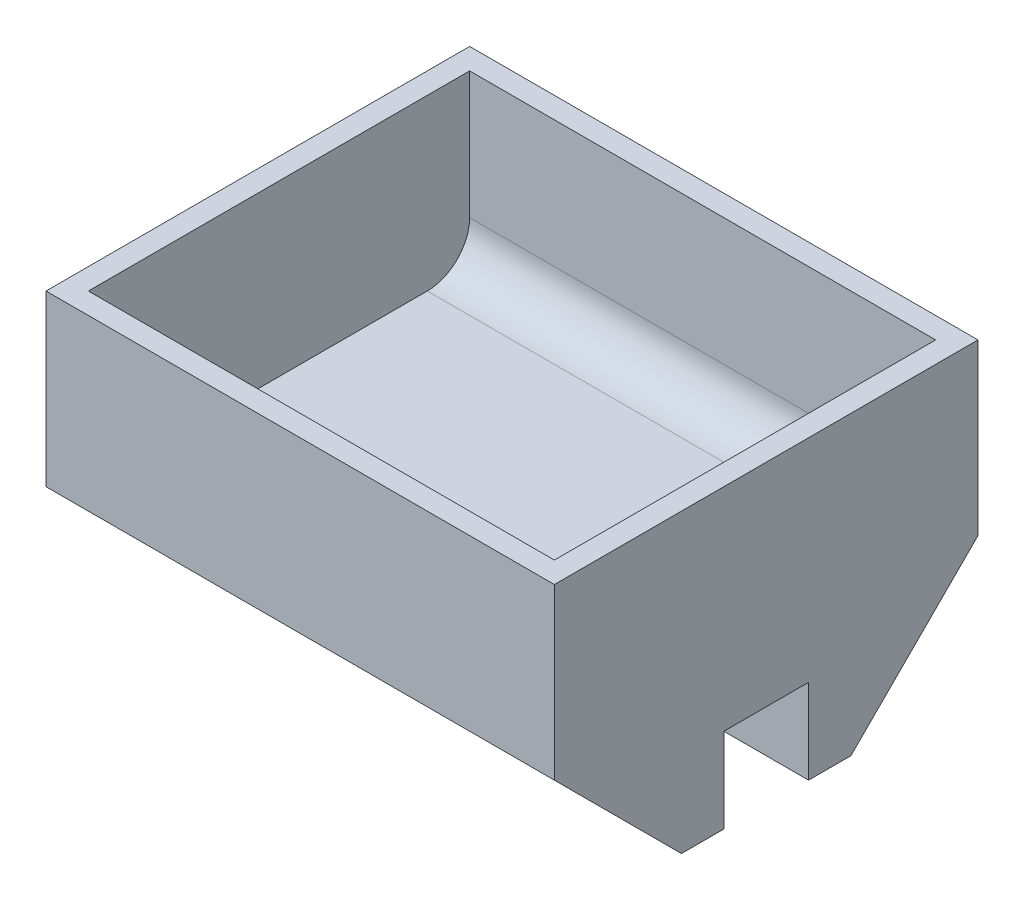
ISO-10303-21;
HEADER;
FILE_DESCRIPTION(('STEP AP214'),'2;1');
FILE_NAME('part.step','',(''),(''),'','','');
FILE_SCHEMA(('AUTOMOTIVE_DESIGN { 1 0 10303 214 1 1 1 1 }'));
ENDSEC;
DATA;
#1=APPLICATION_CONTEXT('core data for automotive mechanical design processes');
#2=APPLICATION_PROTOCOL_DEFINITION('international standard','automotive_design',2000,#1);
#3=PRODUCT_CONTEXT('',#1,'mechanical');
#4=PRODUCT('Part','Part','',(#3));
#5=PRODUCT_RELATED_PRODUCT_CATEGORY('part','',(#4));
#6=PRODUCT_DEFINITION_FORMATION('','',#4);
#7=PRODUCT_DEFINITION_CONTEXT('part definition',#1,'design');
#8=PRODUCT_DEFINITION('design','',#6,#7);
#9=PRODUCT_DEFINITION_SHAPE('','',#8);
#10=(LENGTH_UNIT() NAMED_UNIT(*) SI_UNIT(.MILLI.,.METRE.));
#11=(NAMED_UNIT(*) PLANE_ANGLE_UNIT() SI_UNIT($,.RADIAN.));
#12=(NAMED_UNIT(*) SI_UNIT($,.STERADIAN.) SOLID_ANGLE_UNIT());
#13=UNCERTAINTY_MEASURE_WITH_UNIT(LENGTH_MEASURE(1.E-05),#10,'distance_accuracy_value','');
#14=(GEOMETRIC_REPRESENTATION_CONTEXT(3) GLOBAL_UNCERTAINTY_ASSIGNED_CONTEXT((#13)) GLOBAL_UNIT_ASSIGNED_CONTEXT((#10,
#11,#12)) REPRESENTATION_CONTEXT('',''));
#15=CARTESIAN_POINT('',(0.,0.,0.));
#16=DIRECTION('',(0.,0.,1.));
#17=DIRECTION('',(1.,0.,0.));
#18=AXIS2_PLACEMENT_3D('',#15,#16,#17);
#19=CARTESIAN_POINT('',(50.8,-6.35000000000005,88.9));
#20=DIRECTION('',(0.,0.,-1.));
#21=DIRECTION('',(0.,1.,0.));
#22=AXIS2_PLACEMENT_3D('',#19,#20,#21);
#23=CYLINDRICAL_SURFACE('',#22,6.35);
#24=CARTESIAN_POINT('',(50.8,-6.35000000000003,63.4999999999999));
#25=DIRECTION('',(0.,-0.707106781186548,0.707106781186547));
#26=DIRECTION('',(0.,-0.707106781186547,-0.707106781186548));
#27=AXIS2_PLACEMENT_3D('',#24,#25,#26);
#28=ELLIPSE('',#27,8.98025612106916,6.35);
#29=CARTESIAN_POINT('',(50.8,-12.7,57.1499999999999));
#30=VERTEX_POINT('',#29);
#31=EDGE_CURVE('E222',#30,#30,#28,.T.);
#32=ORIENTED_EDGE('',*,*,#31,.T.);
#33=EDGE_LOOP('',(#32));
#34=FACE_BOUND('',#33,.T.);
#35=CARTESIAN_POINT('',(50.8,-6.35000000000002,48.26));
#36=DIRECTION('',(0.,0.,-1.));
#37=DIRECTION('',(-1.,0.,0.));
#38=AXIS2_PLACEMENT_3D('',#35,#36,#37);
#39=CIRCLE('',#38,6.35);
#40=CARTESIAN_POINT('',(44.45,-6.35000000000002,48.26));
#41=VERTEX_POINT('',#40);
#42=EDGE_CURVE('E11',#41,#41,#39,.F.);
#43=ORIENTED_EDGE('',*,*,#42,.F.);
#44=EDGE_LOOP('',(#43));
#45=FACE_BOUND('',#44,.T.);
#46=ADVANCED_FACE('F39',(#34,#45),#23,.F.);
#47=CARTESIAN_POINT('',(0.,-6.35000000000005,88.9));
#48=DIRECTION('',(0.,0.,-1.));
#49=DIRECTION('',(0.,1.,0.));
#50=AXIS2_PLACEMENT_3D('',#47,#48,#49);
#51=CYLINDRICAL_SURFACE('',#50,6.35);
#52=CARTESIAN_POINT('',(0.,-6.35000000000003,63.4999999999999));
#53=DIRECTION('',(0.,-0.707106781186548,0.707106781186547));
#54=DIRECTION('',(0.,-0.707106781186547,-0.707106781186548));
#55=AXIS2_PLACEMENT_3D('',#52,#53,#54);
#56=ELLIPSE('',#55,8.98025612106915,6.35);
#57=CARTESIAN_POINT('',(0.,-12.7,57.1499999999999));
#58=VERTEX_POINT('',#57);
#59=EDGE_CURVE('E217',#58,#58,#56,.T.);
#60=ORIENTED_EDGE('',*,*,#59,.T.);
#61=EDGE_LOOP('',(#60));
#62=FACE_BOUND('',#61,.T.);
#63=CARTESIAN_POINT('',(0.,-6.35000000000002,48.26));
#64=DIRECTION('',(0.,0.,-1.));
#65=DIRECTION('',(-1.,0.,0.));
#66=AXIS2_PLACEMENT_3D('',#63,#64,#65);
#67=CIRCLE('',#66,6.35);
#68=CARTESIAN_POINT('',(-6.35,-6.35000000000002,48.26));
#69=VERTEX_POINT('',#68);
#70=EDGE_CURVE('E48',#69,#69,#67,.F.);
#71=ORIENTED_EDGE('',*,*,#70,.F.);
#72=EDGE_LOOP('',(#71));
#73=FACE_BOUND('',#72,.T.);
#74=ADVANCED_FACE('F359',(#62,#73),#51,.F.);
#75=CARTESIAN_POINT('',(-50.8,-6.35000000000005,88.9));
#76=DIRECTION('',(0.,0.,-1.));
#77=DIRECTION('',(0.,1.,0.));
#78=AXIS2_PLACEMENT_3D('',#75,#76,#77);
#79=CYLINDRICAL_SURFACE('',#78,6.35);
#80=CARTESIAN_POINT('',(-50.8,-6.35000000000003,63.4999999999999));
#81=DIRECTION('',(0.,-0.707106781186548,0.707106781186547));
#82=DIRECTION('',(0.,-0.707106781186547,-0.707106781186548));
#83=AXIS2_PLACEMENT_3D('',#80,#81,#82);
#84=ELLIPSE('',#83,8.98025612106916,6.35);
#85=CARTESIAN_POINT('',(-50.8,-12.7,57.1499999999999));
#86=VERTEX_POINT('',#85);
#87=EDGE_CURVE('E227',#86,#86,#84,.T.);
#88=ORIENTED_EDGE('',*,*,#87,.T.);
#89=EDGE_LOOP('',(#88));
#90=FACE_BOUND('',#89,.T.);
#91=CARTESIAN_POINT('',(-50.8,-6.35000000000002,48.26));
#92=DIRECTION('',(0.,0.,-1.));
#93=DIRECTION('',(-1.,0.,0.));
#94=AXIS2_PLACEMENT_3D('',#91,#92,#93);
#95=CIRCLE('',#94,6.35);
#96=CARTESIAN_POINT('',(-57.15,-6.35000000000002,48.26));
#97=VERTEX_POINT('',#96);
#98=EDGE_CURVE('E349',#97,#97,#95,.F.);
#99=ORIENTED_EDGE('',*,*,#98,.F.);
#100=EDGE_LOOP('',(#99));
#101=FACE_BOUND('',#100,.T.);
#102=ADVANCED_FACE('F361',(#90,#101),#79,.F.);
#103=CARTESIAN_POINT('',(-231.223256319818,69.85,88.9));
#104=DIRECTION('',(0.,1.,0.));
#105=DIRECTION('',(0.,0.,1.));
#106=AXIS2_PLACEMENT_3D('',#103,#104,#105);
#107=PLANE('',#106);
#108=DIRECTION('',(0.,0.,-1.));
#109=VECTOR('',#108,1.);
#110=CARTESIAN_POINT('',(-76.2,69.85,88.9));
#111=LINE('',#110,#109);
#112=CARTESIAN_POINT('',(-76.2,69.85,88.9));
#113=VERTEX_POINT('',#112);
#114=CARTESIAN_POINT('',(-76.2,69.85,-38.1));
#115=VERTEX_POINT('',#114);
#116=EDGE_CURVE('E235',#113,#115,#111,.T.);
#117=ORIENTED_EDGE('',*,*,#116,.F.);
#118=DIRECTION('',(1.,0.,0.));
#119=VECTOR('',#118,1.);
#120=CARTESIAN_POINT('',(-231.223256319818,69.85,88.9));
#121=LINE('',#120,#119);
#122=CARTESIAN_POINT('',(76.2,69.85,88.9));
#123=VERTEX_POINT('',#122);
#124=EDGE_CURVE('E268',#113,#123,#121,.T.);
#125=ORIENTED_EDGE('',*,*,#124,.T.);
#126=DIRECTION('',(0.,0.,1.));
#127=VECTOR('',#126,1.);
#128=CARTESIAN_POINT('',(76.2,69.85,88.9));
#129=LINE('',#128,#127);
#130=CARTESIAN_POINT('',(76.2,69.85,-38.1));
#131=VERTEX_POINT('',#130);
#132=EDGE_CURVE('E253',#131,#123,#129,.T.);
#133=ORIENTED_EDGE('',*,*,#132,.F.);
#134=DIRECTION('',(1.,0.,0.));
#135=VECTOR('',#134,1.);
#136=CARTESIAN_POINT('',(-231.223256319818,69.85,-38.1));
#137=LINE('',#136,#135);
#138=EDGE_CURVE('E271',#115,#131,#137,.T.);
#139=ORIENTED_EDGE('',*,*,#138,.F.);
#140=EDGE_LOOP('',(#117,#125,#133,#139));
#141=FACE_BOUND('',#140,.T.);
#142=DIRECTION('',(1.,0.,0.));
#143=VECTOR('',#142,1.);
#144=CARTESIAN_POINT('',(-69.85,69.85,82.55));
#145=LINE('',#144,#143);
#146=CARTESIAN_POINT('',(-69.85,69.85,82.55));
#147=VERTEX_POINT('',#146);
#148=CARTESIAN_POINT('',(69.85,69.85,82.55));
#149=VERTEX_POINT('',#148);
#150=EDGE_CURVE('E158',#147,#149,#145,.T.);
#151=ORIENTED_EDGE('',*,*,#150,.F.);
#152=DIRECTION('',(0.,0.,1.));
#153=VECTOR('',#152,1.);
#154=CARTESIAN_POINT('',(-69.85,69.85,82.55));
#155=LINE('',#154,#153);
#156=CARTESIAN_POINT('',(-69.85,69.85,-31.75));
#157=VERTEX_POINT('',#156);
#158=EDGE_CURVE('E166',#157,#147,#155,.T.);
#159=ORIENTED_EDGE('',*,*,#158,.F.);
#160=DIRECTION('',(1.,0.,0.));
#161=VECTOR('',#160,1.);
#162=CARTESIAN_POINT('',(-69.85,69.85,-31.75));
#163=LINE('',#162,#161);
#164=CARTESIAN_POINT('',(69.85,69.85,-31.75));
#165=VERTEX_POINT('',#164);
#166=EDGE_CURVE('E200',#157,#165,#163,.T.);
#167=ORIENTED_EDGE('',*,*,#166,.T.);
#168=DIRECTION('',(0.,0.,1.));
#169=VECTOR('',#168,1.);
#170=CARTESIAN_POINT('',(69.85,69.85,82.55));
#171=LINE('',#170,#169);
#172=EDGE_CURVE('E180',#165,#149,#171,.T.);
#173=ORIENTED_EDGE('',*,*,#172,.T.);
#174=EDGE_LOOP('',(#151,#159,#167,#173));
#175=FACE_BOUND('',#174,.T.);
#176=ADVANCED_FACE('F179',(#141,#175),#107,.T.);
#177=CARTESIAN_POINT('',(50.8,-6.34999999999999,-12.7));
#178=DIRECTION('',(0.,-0.707106781186547,-0.707106781186547));
#179=DIRECTION('',(0.,0.707106781186548,-0.707106781186548));
#180=AXIS2_PLACEMENT_3D('',#177,#178,#179);
#181=ELLIPSE('',#180,8.98025612106916,6.35);
#182=CARTESIAN_POINT('',(50.8,0.,-19.05));
#183=VERTEX_POINT('',#182);
#184=EDGE_CURVE('E221',#183,#183,#181,.T.);
#185=ORIENTED_EDGE('',*,*,#184,.T.);
#186=EDGE_LOOP('',(#185));
#187=FACE_BOUND('',#186,.T.);
#188=CARTESIAN_POINT('',(50.8,-6.35,2.54));
#189=DIRECTION('',(0.,0.,1.));
#190=DIRECTION('',(1.,0.,0.));
#191=AXIS2_PLACEMENT_3D('',#188,#189,#190);
#192=CIRCLE('',#191,6.35);
#193=CARTESIAN_POINT('',(57.15,-6.35,2.54));
#194=VERTEX_POINT('',#193);
#195=EDGE_CURVE('E345',#194,#194,#192,.F.);
#196=ORIENTED_EDGE('',*,*,#195,.F.);
#197=EDGE_LOOP('',(#196));
#198=FACE_BOUND('',#197,.T.);
#199=ADVANCED_FACE('F374',(#187,#198),#23,.F.);
#200=CARTESIAN_POINT('',(0.,-6.34999999999999,-12.7));
#201=DIRECTION('',(0.,-0.707106781186547,-0.707106781186547));
#202=DIRECTION('',(0.,0.707106781186548,-0.707106781186548));
#203=AXIS2_PLACEMENT_3D('',#200,#201,#202);
#204=ELLIPSE('',#203,8.98025612106916,6.35);
#205=CARTESIAN_POINT('',(0.,0.,-19.05));
#206=VERTEX_POINT('',#205);
#207=EDGE_CURVE('E213',#206,#206,#204,.T.);
#208=ORIENTED_EDGE('',*,*,#207,.T.);
#209=EDGE_LOOP('',(#208));
#210=FACE_BOUND('',#209,.T.);
#211=CARTESIAN_POINT('',(0.,-6.35,2.54));
#212=DIRECTION('',(0.,0.,1.));
#213=DIRECTION('',(1.,0.,0.));
#214=AXIS2_PLACEMENT_3D('',#211,#212,#213);
#215=CIRCLE('',#214,6.35);
#216=CARTESIAN_POINT('',(6.35,-6.35,2.54));
#217=VERTEX_POINT('',#216);
#218=EDGE_CURVE('E341',#217,#217,#215,.F.);
#219=ORIENTED_EDGE('',*,*,#218,.F.);
#220=EDGE_LOOP('',(#219));
#221=FACE_BOUND('',#220,.T.);
#222=ADVANCED_FACE('F364',(#210,#221),#51,.F.);
#223=CARTESIAN_POINT('',(-50.8,-6.34999999999999,-12.7));
#224=DIRECTION('',(0.,-0.707106781186547,-0.707106781186547));
#225=DIRECTION('',(0.,0.707106781186548,-0.707106781186548));
#226=AXIS2_PLACEMENT_3D('',#223,#224,#225);
#227=ELLIPSE('',#226,8.98025612106916,6.35);
#228=CARTESIAN_POINT('',(-50.8,0.,-19.05));
#229=VERTEX_POINT('',#228);
#230=EDGE_CURVE('E226',#229,#229,#227,.T.);
#231=ORIENTED_EDGE('',*,*,#230,.T.);
#232=EDGE_LOOP('',(#231));
#233=FACE_BOUND('',#232,.T.);
#234=CARTESIAN_POINT('',(-50.8,-6.35,2.54));
#235=DIRECTION('',(0.,0.,1.));
#236=DIRECTION('',(1.,0.,0.));
#237=AXIS2_PLACEMENT_3D('',#234,#235,#236);
#238=CIRCLE('',#237,6.35);
#239=CARTESIAN_POINT('',(-44.45,-6.35,2.54));
#240=VERTEX_POINT('',#239);
#241=EDGE_CURVE('E328',#240,#240,#238,.F.);
#242=ORIENTED_EDGE('',*,*,#241,.F.);
#243=EDGE_LOOP('',(#242));
#244=FACE_BOUND('',#243,.T.);
#245=ADVANCED_FACE('F371',(#233,#244),#79,.F.);
#246=CARTESIAN_POINT('',(-76.2,-19.05,50.8));
#247=DIRECTION('',(0.,1.,0.));
#248=DIRECTION('',(0.,0.,1.));
#249=AXIS2_PLACEMENT_3D('',#246,#247,#248);
#250=PLANE('',#249);
#251=DIRECTION('',(0.,0.,-1.));
#252=VECTOR('',#251,1.);
#253=CARTESIAN_POINT('',(76.2,-19.05,50.8));
#254=LINE('',#253,#252);
#255=CARTESIAN_POINT('',(76.2,-19.05,12.7));
#256=VERTEX_POINT('',#255);
#257=CARTESIAN_POINT('',(76.2,-19.05,0.));
#258=VERTEX_POINT('',#257);
#259=EDGE_CURVE('E315',#256,#258,#254,.T.);
#260=ORIENTED_EDGE('',*,*,#259,.F.);
#261=DIRECTION('',(-1.,0.,0.));
#262=VECTOR('',#261,1.);
#263=CARTESIAN_POINT('',(112.121024484277,-19.05,12.7));
#264=LINE('',#263,#262);
#265=CARTESIAN_POINT('',(-76.2,-19.05,12.7));
#266=VERTEX_POINT('',#265);
#267=EDGE_CURVE('E300',#256,#266,#264,.T.);
#268=ORIENTED_EDGE('',*,*,#267,.T.);
#269=DIRECTION('',(0.,0.,-1.));
#270=VECTOR('',#269,1.);
#271=CARTESIAN_POINT('',(-76.2,-19.05,50.8));
#272=LINE('',#271,#270);
#273=CARTESIAN_POINT('',(-76.2,-19.05,0.));
#274=VERTEX_POINT('',#273);
#275=EDGE_CURVE('E323',#266,#274,#272,.T.);
#276=ORIENTED_EDGE('',*,*,#275,.T.);
#277=DIRECTION('',(1.,0.,0.));
#278=VECTOR('',#277,1.);
#279=CARTESIAN_POINT('',(-76.2,-19.05,0.));
#280=LINE('',#279,#278);
#281=EDGE_CURVE('E289',#274,#258,#280,.T.);
#282=ORIENTED_EDGE('',*,*,#281,.T.);
#283=EDGE_LOOP('',(#260,#268,#276,#282));
#284=FACE_BOUND('',#283,.T.);
#285=ADVANCED_FACE('F382',(#284),#250,.F.);
#286=CARTESIAN_POINT('',(76.2,19.05,50.8));
#287=DIRECTION('',(-1.,0.,0.));
#288=DIRECTION('',(0.,0.,1.));
#289=AXIS2_PLACEMENT_3D('',#286,#287,#288);
#290=PLANE('',#289);
#291=DIRECTION('',(0.,0.,1.));
#292=VECTOR('',#291,1.);
#293=CARTESIAN_POINT('',(76.2,6.35,12.7));
#294=LINE('',#293,#292);
#295=CARTESIAN_POINT('',(76.2,6.35,12.7));
#296=VERTEX_POINT('',#295);
#297=CARTESIAN_POINT('',(76.2,6.35,38.1));
#298=VERTEX_POINT('',#297);
#299=EDGE_CURVE('E282',#296,#298,#294,.T.);
#300=ORIENTED_EDGE('',*,*,#299,.F.);
#301=DIRECTION('',(0.,1.,0.));
#302=VECTOR('',#301,1.);
#303=CARTESIAN_POINT('',(76.2,-19.05,12.7));
#304=LINE('',#303,#302);
#305=EDGE_CURVE('E286',#256,#296,#304,.T.);
#306=ORIENTED_EDGE('',*,*,#305,.F.);
#307=ORIENTED_EDGE('',*,*,#259,.T.);
#308=DIRECTION('',(0.,0.707106781186547,-0.707106781186547));
#309=VECTOR('',#308,1.);
#310=CARTESIAN_POINT('',(76.2,-19.05,0.));
#311=LINE('',#310,#309);
#312=CARTESIAN_POINT('',(76.2,19.05,-38.1));
#313=VERTEX_POINT('',#312);
#314=EDGE_CURVE('E231',#258,#313,#311,.T.);
#315=ORIENTED_EDGE('',*,*,#314,.T.);
#316=DIRECTION('',(0.,1.,0.));
#317=VECTOR('',#316,1.);
#318=CARTESIAN_POINT('',(76.2,19.05,-38.1));
#319=LINE('',#318,#317);
#320=EDGE_CURVE('E249',#313,#131,#319,.T.);
#321=ORIENTED_EDGE('',*,*,#320,.T.);
#322=ORIENTED_EDGE('',*,*,#132,.T.);
#323=DIRECTION('',(0.,-1.,0.));
#324=VECTOR('',#323,1.);
#325=CARTESIAN_POINT('',(76.2,19.05,88.9));
#326=LINE('',#325,#324);
#327=CARTESIAN_POINT('',(76.2,19.05,88.9));
#328=VERTEX_POINT('',#327);
#329=EDGE_CURVE('E257',#123,#328,#326,.T.);
#330=ORIENTED_EDGE('',*,*,#329,.T.);
#331=DIRECTION('',(0.,-0.707106781186547,-0.707106781186548));
#332=VECTOR('',#331,1.);
#333=CARTESIAN_POINT('',(76.2,-19.05,50.8));
#334=LINE('',#333,#332);
#335=CARTESIAN_POINT('',(76.2,-19.05,50.8));
#336=VERTEX_POINT('',#335);
#337=EDGE_CURVE('E261',#328,#336,#334,.T.);
#338=ORIENTED_EDGE('',*,*,#337,.T.);
#339=CARTESIAN_POINT('',(76.2,-19.05,38.1));
#340=VERTEX_POINT('',#339);
#341=EDGE_CURVE('E319',#336,#340,#254,.T.);
#342=ORIENTED_EDGE('',*,*,#341,.T.);
#343=DIRECTION('',(0.,-1.,0.));
#344=VECTOR('',#343,1.);
#345=CARTESIAN_POINT('',(76.2,-19.05,38.1));
#346=LINE('',#345,#344);
#347=EDGE_CURVE('E63',#298,#340,#346,.T.);
#348=ORIENTED_EDGE('',*,*,#347,.F.);
#349=EDGE_LOOP('',(#300,#306,#307,#315,#321,#322,#330,#338,#342,#348));
#350=FACE_BOUND('',#349,.T.);
#351=ADVANCED_FACE('F41',(#350),#290,.F.);
#352=CARTESIAN_POINT('',(-76.2,19.05,50.8));
#353=DIRECTION('',(1.,0.,0.));
#354=DIRECTION('',(0.,0.,-1.));
#355=AXIS2_PLACEMENT_3D('',#352,#353,#354);
#356=PLANE('',#355);
#357=CARTESIAN_POINT('',(-76.2,-19.05,50.8));
#358=VERTEX_POINT('',#357);
#359=CARTESIAN_POINT('',(-76.2,-19.05,38.1));
#360=VERTEX_POINT('',#359);
#361=EDGE_CURVE('E324',#358,#360,#272,.T.);
#362=ORIENTED_EDGE('',*,*,#361,.F.);
#363=DIRECTION('',(0.,0.707106781186547,0.707106781186548));
#364=VECTOR('',#363,1.);
#365=CARTESIAN_POINT('',(-76.2,-19.05,50.8));
#366=LINE('',#365,#364);
#367=CARTESIAN_POINT('',(-76.2,19.05,88.9));
#368=VERTEX_POINT('',#367);
#369=EDGE_CURVE('E242',#358,#368,#366,.T.);
#370=ORIENTED_EDGE('',*,*,#369,.T.);
#371=DIRECTION('',(0.,1.,0.));
#372=VECTOR('',#371,1.);
#373=CARTESIAN_POINT('',(-76.2,19.05,88.9));
#374=LINE('',#373,#372);
#375=EDGE_CURVE('E239',#368,#113,#374,.T.);
#376=ORIENTED_EDGE('',*,*,#375,.T.);
#377=ORIENTED_EDGE('',*,*,#116,.T.);
#378=DIRECTION('',(0.,-1.,0.));
#379=VECTOR('',#378,1.);
#380=CARTESIAN_POINT('',(-76.2,19.05,-38.1));
#381=LINE('',#380,#379);
#382=CARTESIAN_POINT('',(-76.2,19.05,-38.1));
#383=VERTEX_POINT('',#382);
#384=EDGE_CURVE('E232',#115,#383,#381,.T.);
#385=ORIENTED_EDGE('',*,*,#384,.T.);
#386=DIRECTION('',(0.,-0.707106781186548,0.707106781186548));
#387=VECTOR('',#386,1.);
#388=CARTESIAN_POINT('',(-76.2,-19.05,0.));
#389=LINE('',#388,#387);
#390=EDGE_CURVE('E245',#383,#274,#389,.T.);
#391=ORIENTED_EDGE('',*,*,#390,.T.);
#392=ORIENTED_EDGE('',*,*,#275,.F.);
#393=DIRECTION('',(0.,-1.,0.));
#394=VECTOR('',#393,1.);
#395=CARTESIAN_POINT('',(-76.2,-19.05,12.7));
#396=LINE('',#395,#394);
#397=CARTESIAN_POINT('',(-76.2,6.35,12.7));
#398=VERTEX_POINT('',#397);
#399=EDGE_CURVE('E279',#398,#266,#396,.T.);
#400=ORIENTED_EDGE('',*,*,#399,.F.);
#401=DIRECTION('',(0.,0.,-1.));
#402=VECTOR('',#401,1.);
#403=CARTESIAN_POINT('',(-76.2,6.35,12.7));
#404=LINE('',#403,#402);
#405=CARTESIAN_POINT('',(-76.2,6.35,38.1));
#406=VERTEX_POINT('',#405);
#407=EDGE_CURVE('E296',#406,#398,#404,.T.);
#408=ORIENTED_EDGE('',*,*,#407,.F.);
#409=DIRECTION('',(0.,1.,0.));
#410=VECTOR('',#409,1.);
#411=CARTESIAN_POINT('',(-76.2,-19.05,38.1));
#412=LINE('',#411,#410);
#413=EDGE_CURVE('E292',#360,#406,#412,.T.);
#414=ORIENTED_EDGE('',*,*,#413,.F.);
#415=EDGE_LOOP('',(#362,#370,#376,#377,#385,#391,#392,#400,#408,#414));
#416=FACE_BOUND('',#415,.T.);
#417=ADVANCED_FACE('F569',(#416),#356,.F.);
#418=ORIENTED_EDGE('',*,*,#361,.T.);
#419=DIRECTION('',(-1.,0.,0.));
#420=VECTOR('',#419,1.);
#421=CARTESIAN_POINT('',(112.121024484277,-19.05,38.1));
#422=LINE('',#421,#420);
#423=EDGE_CURVE('E306',#340,#360,#422,.T.);
#424=ORIENTED_EDGE('',*,*,#423,.F.);
#425=ORIENTED_EDGE('',*,*,#341,.F.);
#426=DIRECTION('',(1.,0.,0.));
#427=VECTOR('',#426,1.);
#428=CARTESIAN_POINT('',(-76.2,-19.05,50.8));
#429=LINE('',#428,#427);
#430=EDGE_CURVE('E312',#358,#336,#429,.T.);
#431=ORIENTED_EDGE('',*,*,#430,.F.);
#432=EDGE_LOOP('',(#418,#424,#425,#431));
#433=FACE_BOUND('',#432,.T.);
#434=ADVANCED_FACE('F427',(#433),#250,.F.);
#435=CARTESIAN_POINT('',(112.121024484277,-19.05,12.7));
#436=DIRECTION('',(0.,0.,-1.));
#437=DIRECTION('',(-1.,0.,0.));
#438=AXIS2_PLACEMENT_3D('',#435,#436,#437);
#439=PLANE('',#438);
#440=ORIENTED_EDGE('',*,*,#305,.T.);
#441=DIRECTION('',(-1.,0.,0.));
#442=VECTOR('',#441,1.);
#443=CARTESIAN_POINT('',(112.121024484277,6.35,12.7));
#444=LINE('',#443,#442);
#445=EDGE_CURVE('E283',#296,#398,#444,.T.);
#446=ORIENTED_EDGE('',*,*,#445,.T.);
#447=ORIENTED_EDGE('',*,*,#399,.T.);
#448=ORIENTED_EDGE('',*,*,#267,.F.);
#449=EDGE_LOOP('',(#440,#446,#447,#448));
#450=FACE_BOUND('',#449,.T.);
#451=CARTESIAN_POINT('',(-50.8,-6.35000000000003,12.7));
#452=DIRECTION('',(0.,0.,1.));
#453=DIRECTION('',(1.,0.,0.));
#454=AXIS2_PLACEMENT_3D('',#451,#452,#453);
#455=CIRCLE('',#454,3.429);
#456=CARTESIAN_POINT('',(-47.371,-6.35000000000003,12.7));
#457=VERTEX_POINT('',#456);
#458=EDGE_CURVE('E205',#457,#457,#455,.T.);
#459=ORIENTED_EDGE('',*,*,#458,.F.);
#460=EDGE_LOOP('',(#459));
#461=FACE_BOUND('',#460,.T.);
#462=CARTESIAN_POINT('',(0.,-6.35000000000003,12.7));
#463=DIRECTION('',(0.,0.,1.));
#464=DIRECTION('',(1.,0.,0.));
#465=AXIS2_PLACEMENT_3D('',#462,#463,#464);
#466=CIRCLE('',#465,3.429);
#467=CARTESIAN_POINT('',(3.429,-6.35000000000003,12.7));
#468=VERTEX_POINT('',#467);
#469=EDGE_CURVE('E195',#468,#468,#466,.T.);
#470=ORIENTED_EDGE('',*,*,#469,.F.);
#471=EDGE_LOOP('',(#470));
#472=FACE_BOUND('',#471,.T.);
#473=CARTESIAN_POINT('',(50.8,-6.35000000000003,12.7));
#474=DIRECTION('',(0.,0.,1.));
#475=DIRECTION('',(1.,0.,0.));
#476=AXIS2_PLACEMENT_3D('',#473,#474,#475);
#477=CIRCLE('',#476,3.429);
#478=CARTESIAN_POINT('',(54.229,-6.35000000000003,12.7));
#479=VERTEX_POINT('',#478);
#480=EDGE_CURVE('E196',#479,#479,#477,.T.);
#481=ORIENTED_EDGE('',*,*,#480,.F.);
#482=EDGE_LOOP('',(#481));
#483=FACE_BOUND('',#482,.T.);
#484=ADVANCED_FACE('F423',(#450,#461,#472,#483),#439,.F.);
#485=CARTESIAN_POINT('',(112.121024484277,6.35,12.7));
#486=DIRECTION('',(0.,1.,0.));
#487=DIRECTION('',(0.,0.,1.));
#488=AXIS2_PLACEMENT_3D('',#485,#486,#487);
#489=PLANE('',#488);
#490=ORIENTED_EDGE('',*,*,#299,.T.);
#491=DIRECTION('',(-1.,0.,0.));
#492=VECTOR('',#491,1.);
#493=CARTESIAN_POINT('',(112.121024484277,6.35,38.1));
#494=LINE('',#493,#492);
#495=EDGE_CURVE('E303',#298,#406,#494,.T.);
#496=ORIENTED_EDGE('',*,*,#495,.T.);
#497=ORIENTED_EDGE('',*,*,#407,.T.);
#498=ORIENTED_EDGE('',*,*,#445,.F.);
#499=EDGE_LOOP('',(#490,#496,#497,#498));
#500=FACE_BOUND('',#499,.T.);
#501=ADVANCED_FACE('F426',(#500),#489,.F.);
#502=CARTESIAN_POINT('',(112.121024484277,-19.05,38.1));
#503=DIRECTION('',(0.,0.,1.));
#504=DIRECTION('',(0.,-1.,0.));
#505=AXIS2_PLACEMENT_3D('',#502,#503,#504);
#506=PLANE('',#505);
#507=ORIENTED_EDGE('',*,*,#347,.T.);
#508=ORIENTED_EDGE('',*,*,#423,.T.);
#509=ORIENTED_EDGE('',*,*,#413,.T.);
#510=ORIENTED_EDGE('',*,*,#495,.F.);
#511=EDGE_LOOP('',(#507,#508,#509,#510));
#512=FACE_BOUND('',#511,.T.);
#513=CARTESIAN_POINT('',(-50.8,-6.35000000000003,38.1));
#514=DIRECTION('',(0.,0.,1.));
#515=DIRECTION('',(1.,0.,0.));
#516=AXIS2_PLACEMENT_3D('',#513,#514,#515);
#517=CIRCLE('',#516,3.429);
#518=CARTESIAN_POINT('',(-47.371,-6.35000000000003,38.1));
#519=VERTEX_POINT('',#518);
#520=EDGE_CURVE('E508',#519,#519,#517,.T.);
#521=ORIENTED_EDGE('',*,*,#520,.T.);
#522=EDGE_LOOP('',(#521));
#523=FACE_BOUND('',#522,.T.);
#524=CARTESIAN_POINT('',(0.,-6.35000000000003,38.1));
#525=DIRECTION('',(0.,0.,1.));
#526=DIRECTION('',(1.,0.,0.));
#527=AXIS2_PLACEMENT_3D('',#524,#525,#526);
#528=CIRCLE('',#527,3.429);
#529=CARTESIAN_POINT('',(3.429,-6.35000000000003,38.1));
#530=VERTEX_POINT('',#529);
#531=EDGE_CURVE('E501',#530,#530,#528,.T.);
#532=ORIENTED_EDGE('',*,*,#531,.T.);
#533=EDGE_LOOP('',(#532));
#534=FACE_BOUND('',#533,.T.);
#535=CARTESIAN_POINT('',(50.8,-6.35000000000003,38.1));
#536=DIRECTION('',(0.,0.,1.));
#537=DIRECTION('',(1.,0.,0.));
#538=AXIS2_PLACEMENT_3D('',#535,#536,#537);
#539=CIRCLE('',#538,3.429);
#540=CARTESIAN_POINT('',(54.229,-6.35000000000003,38.1));
#541=VERTEX_POINT('',#540);
#542=EDGE_CURVE('E496',#541,#541,#539,.T.);
#543=ORIENTED_EDGE('',*,*,#542,.T.);
#544=EDGE_LOOP('',(#543));
#545=FACE_BOUND('',#544,.T.);
#546=ADVANCED_FACE('F609',(#512,#523,#534,#545),#506,.F.);
#547=CARTESIAN_POINT('',(-231.223256319818,-19.05,50.8));
#548=DIRECTION('',(0.,-0.707106781186548,0.707106781186547));
#549=DIRECTION('',(0.,-0.707106781186547,-0.707106781186548));
#550=AXIS2_PLACEMENT_3D('',#547,#548,#549);
#551=PLANE('',#550);
#552=ORIENTED_EDGE('',*,*,#87,.F.);
#553=EDGE_LOOP('',(#552));
#554=FACE_BOUND('',#553,.T.);
#555=ORIENTED_EDGE('',*,*,#31,.F.);
#556=EDGE_LOOP('',(#555));
#557=FACE_BOUND('',#556,.T.);
#558=ORIENTED_EDGE('',*,*,#59,.F.);
#559=EDGE_LOOP('',(#558));
#560=FACE_BOUND('',#559,.T.);
#561=ORIENTED_EDGE('',*,*,#369,.F.);
#562=ORIENTED_EDGE('',*,*,#430,.T.);
#563=ORIENTED_EDGE('',*,*,#337,.F.);
#564=DIRECTION('',(1.,0.,0.));
#565=VECTOR('',#564,1.);
#566=CARTESIAN_POINT('',(-231.223256319818,19.05,88.9));
#567=LINE('',#566,#565);
#568=EDGE_CURVE('E236',#368,#328,#567,.T.);
#569=ORIENTED_EDGE('',*,*,#568,.F.);
#570=EDGE_LOOP('',(#561,#562,#563,#569));
#571=FACE_BOUND('',#570,.T.);
#572=ADVANCED_FACE('F587',(#554,#557,#560,#571),#551,.T.);
#573=CARTESIAN_POINT('',(-231.223256319818,19.05,88.9));
#574=DIRECTION('',(0.,0.,1.));
#575=DIRECTION('',(1.,0.,0.));
#576=AXIS2_PLACEMENT_3D('',#573,#574,#575);
#577=PLANE('',#576);
#578=ORIENTED_EDGE('',*,*,#375,.F.);
#579=ORIENTED_EDGE('',*,*,#568,.T.);
#580=ORIENTED_EDGE('',*,*,#329,.F.);
#581=ORIENTED_EDGE('',*,*,#124,.F.);
#582=EDGE_LOOP('',(#578,#579,#580,#581));
#583=FACE_BOUND('',#582,.T.);
#584=ADVANCED_FACE('F594',(#583),#577,.T.);
#585=CARTESIAN_POINT('',(-231.223256319818,19.05,-38.1));
#586=DIRECTION('',(0.,0.,-1.));
#587=DIRECTION('',(-1.,0.,0.));
#588=AXIS2_PLACEMENT_3D('',#585,#586,#587);
#589=PLANE('',#588);
#590=ORIENTED_EDGE('',*,*,#384,.F.);
#591=ORIENTED_EDGE('',*,*,#138,.T.);
#592=ORIENTED_EDGE('',*,*,#320,.F.);
#593=DIRECTION('',(1.,0.,0.));
#594=VECTOR('',#593,1.);
#595=CARTESIAN_POINT('',(-231.223256319818,19.05,-38.1));
#596=LINE('',#595,#594);
#597=EDGE_CURVE('E265',#383,#313,#596,.T.);
#598=ORIENTED_EDGE('',*,*,#597,.F.);
#599=EDGE_LOOP('',(#590,#591,#592,#598));
#600=FACE_BOUND('',#599,.T.);
#601=ADVANCED_FACE('F413',(#600),#589,.T.);
#602=CARTESIAN_POINT('',(-231.223256319818,-19.05,0.));
#603=DIRECTION('',(0.,-0.707106781186547,-0.707106781186547));
#604=DIRECTION('',(0.,0.707106781186548,-0.707106781186548));
#605=AXIS2_PLACEMENT_3D('',#602,#603,#604);
#606=PLANE('',#605);
#607=ORIENTED_EDGE('',*,*,#230,.F.);
#608=EDGE_LOOP('',(#607));
#609=FACE_BOUND('',#608,.T.);
#610=ORIENTED_EDGE('',*,*,#184,.F.);
#611=EDGE_LOOP('',(#610));
#612=FACE_BOUND('',#611,.T.);
#613=ORIENTED_EDGE('',*,*,#207,.F.);
#614=EDGE_LOOP('',(#613));
#615=FACE_BOUND('',#614,.T.);
#616=ORIENTED_EDGE('',*,*,#390,.F.);
#617=ORIENTED_EDGE('',*,*,#597,.T.);
#618=ORIENTED_EDGE('',*,*,#314,.F.);
#619=ORIENTED_EDGE('',*,*,#281,.F.);
#620=EDGE_LOOP('',(#616,#617,#618,#619));
#621=FACE_BOUND('',#620,.T.);
#622=ADVANCED_FACE('F408',(#609,#612,#615,#621),#606,.T.);
#623=CARTESIAN_POINT('',(-50.8,-6.35000000000003,2.54));
#624=DIRECTION('',(0.,0.,1.));
#625=DIRECTION('',(1.,0.,0.));
#626=AXIS2_PLACEMENT_3D('',#623,#624,#625);
#627=PLANE('',#626);
#628=CARTESIAN_POINT('',(-50.8,-6.35000000000003,2.54));
#629=DIRECTION('',(0.,0.,1.));
#630=DIRECTION('',(1.,0.,0.));
#631=AXIS2_PLACEMENT_3D('',#628,#629,#630);
#632=CIRCLE('',#631,3.429);
#633=CARTESIAN_POINT('',(-47.371,-6.35000000000003,2.54));
#634=VERTEX_POINT('',#633);
#635=EDGE_CURVE('E209',#634,#634,#632,.T.);
#636=ORIENTED_EDGE('',*,*,#635,.T.);
#637=EDGE_LOOP('',(#636));
#638=FACE_BOUND('',#637,.T.);
#639=ORIENTED_EDGE('',*,*,#241,.T.);
#640=EDGE_LOOP('',(#639));
#641=FACE_BOUND('',#640,.T.);
#642=ADVANCED_FACE('F402',(#638,#641),#627,.F.);
#643=CARTESIAN_POINT('',(-50.8,-6.35000000000003,2.54));
#644=DIRECTION('',(0.,0.,1.));
#645=DIRECTION('',(1.,0.,0.));
#646=AXIS2_PLACEMENT_3D('',#643,#644,#645);
#647=CYLINDRICAL_SURFACE('',#646,3.429);
#648=ORIENTED_EDGE('',*,*,#635,.F.);
#649=EDGE_LOOP('',(#648));
#650=FACE_BOUND('',#649,.T.);
#651=ORIENTED_EDGE('',*,*,#458,.T.);
#652=EDGE_LOOP('',(#651));
#653=FACE_BOUND('',#652,.T.);
#654=ADVANCED_FACE('F392',(#650,#653),#647,.F.);
#655=CARTESIAN_POINT('',(0.,-6.35000000000003,2.54));
#656=DIRECTION('',(0.,0.,1.));
#657=DIRECTION('',(1.,0.,0.));
#658=AXIS2_PLACEMENT_3D('',#655,#656,#657);
#659=PLANE('',#658);
#660=CARTESIAN_POINT('',(0.,-6.35000000000003,2.54));
#661=DIRECTION('',(0.,0.,1.));
#662=DIRECTION('',(1.,0.,0.));
#663=AXIS2_PLACEMENT_3D('',#660,#661,#662);
#664=CIRCLE('',#663,3.429);
#665=CARTESIAN_POINT('',(3.429,-6.35000000000003,2.54));
#666=VERTEX_POINT('',#665);
#667=EDGE_CURVE('E201',#666,#666,#664,.T.);
#668=ORIENTED_EDGE('',*,*,#667,.T.);
#669=EDGE_LOOP('',(#668));
#670=FACE_BOUND('',#669,.T.);
#671=ORIENTED_EDGE('',*,*,#218,.T.);
#672=EDGE_LOOP('',(#671));
#673=FACE_BOUND('',#672,.T.);
#674=ADVANCED_FACE('F389',(#670,#673),#659,.F.);
#675=CARTESIAN_POINT('',(0.,-6.35000000000003,2.54));
#676=DIRECTION('',(0.,0.,1.));
#677=DIRECTION('',(1.,0.,0.));
#678=AXIS2_PLACEMENT_3D('',#675,#676,#677);
#679=CYLINDRICAL_SURFACE('',#678,3.429);
#680=ORIENTED_EDGE('',*,*,#667,.F.);
#681=EDGE_LOOP('',(#680));
#682=FACE_BOUND('',#681,.T.);
#683=ORIENTED_EDGE('',*,*,#469,.T.);
#684=EDGE_LOOP('',(#683));
#685=FACE_BOUND('',#684,.T.);
#686=ADVANCED_FACE('F391',(#682,#685),#679,.F.);
#687=CARTESIAN_POINT('',(50.8,-6.35000000000003,2.54));
#688=DIRECTION('',(0.,0.,1.));
#689=DIRECTION('',(1.,0.,0.));
#690=AXIS2_PLACEMENT_3D('',#687,#688,#689);
#691=PLANE('',#690);
#692=CARTESIAN_POINT('',(50.8,-6.35000000000003,2.54));
#693=DIRECTION('',(0.,0.,1.));
#694=DIRECTION('',(1.,0.,0.));
#695=AXIS2_PLACEMENT_3D('',#692,#693,#694);
#696=CIRCLE('',#695,3.429);
#697=CARTESIAN_POINT('',(54.229,-6.35000000000003,2.54));
#698=VERTEX_POINT('',#697);
#699=EDGE_CURVE('E191',#698,#698,#696,.T.);
#700=ORIENTED_EDGE('',*,*,#699,.T.);
#701=EDGE_LOOP('',(#700));
#702=FACE_BOUND('',#701,.T.);
#703=ORIENTED_EDGE('',*,*,#195,.T.);
#704=EDGE_LOOP('',(#703));
#705=FACE_BOUND('',#704,.T.);
#706=ADVANCED_FACE('F399',(#702,#705),#691,.F.);
#707=CARTESIAN_POINT('',(50.8,-6.35000000000003,2.54));
#708=DIRECTION('',(0.,0.,1.));
#709=DIRECTION('',(1.,0.,0.));
#710=AXIS2_PLACEMENT_3D('',#707,#708,#709);
#711=CYLINDRICAL_SURFACE('',#710,3.429);
#712=ORIENTED_EDGE('',*,*,#699,.F.);
#713=EDGE_LOOP('',(#712));
#714=FACE_BOUND('',#713,.T.);
#715=ORIENTED_EDGE('',*,*,#480,.T.);
#716=EDGE_LOOP('',(#715));
#717=FACE_BOUND('',#716,.T.);
#718=ADVANCED_FACE('F434',(#714,#717),#711,.F.);
#719=CARTESIAN_POINT('',(-69.85,31.75,-31.75));
#720=DIRECTION('',(0.,0.,-1.));
#721=DIRECTION('',(-1.,0.,0.));
#722=AXIS2_PLACEMENT_3D('',#719,#720,#721);
#723=PLANE('',#722);
#724=DIRECTION('',(0.,1.,0.));
#725=VECTOR('',#724,1.);
#726=CARTESIAN_POINT('',(69.85,31.75,-31.75));
#727=LINE('',#726,#725);
#728=CARTESIAN_POINT('',(69.85,31.75,-31.75));
#729=VERTEX_POINT('',#728);
#730=EDGE_CURVE('E177',#729,#165,#727,.T.);
#731=ORIENTED_EDGE('',*,*,#730,.T.);
#732=ORIENTED_EDGE('',*,*,#166,.F.);
#733=DIRECTION('',(0.,1.,0.));
#734=VECTOR('',#733,1.);
#735=CARTESIAN_POINT('',(-69.85,31.75,-31.75));
#736=LINE('',#735,#734);
#737=CARTESIAN_POINT('',(-69.85,31.75,-31.75));
#738=VERTEX_POINT('',#737);
#739=EDGE_CURVE('E173',#738,#157,#736,.T.);
#740=ORIENTED_EDGE('',*,*,#739,.F.);
#741=DIRECTION('',(1.,0.,0.));
#742=VECTOR('',#741,1.);
#743=CARTESIAN_POINT('',(-69.85,31.75,-31.75));
#744=LINE('',#743,#742);
#745=EDGE_CURVE('E548',#738,#729,#744,.T.);
#746=ORIENTED_EDGE('',*,*,#745,.T.);
#747=EDGE_LOOP('',(#731,#732,#740,#746));
#748=FACE_BOUND('',#747,.T.);
#749=ADVANCED_FACE('F436',(#748),#723,.F.);
#750=CARTESIAN_POINT('',(-69.85,31.75,-19.05));
#751=DIRECTION('',(1.,0.,0.));
#752=DIRECTION('',(0.,0.,-1.));
#753=AXIS2_PLACEMENT_3D('',#750,#751,#752);
#754=CYLINDRICAL_SURFACE('',#753,12.7);
#755=CARTESIAN_POINT('',(69.85,31.75,-19.05));
#756=DIRECTION('',(1.,0.,0.));
#757=DIRECTION('',(0.,0.,-1.));
#758=AXIS2_PLACEMENT_3D('',#755,#756,#757);
#759=CIRCLE('',#758,12.7);
#760=CARTESIAN_POINT('',(69.85,19.05,-19.05));
#761=VERTEX_POINT('',#760);
#762=EDGE_CURVE('E539',#761,#729,#759,.T.);
#763=ORIENTED_EDGE('',*,*,#762,.T.);
#764=ORIENTED_EDGE('',*,*,#745,.F.);
#765=CARTESIAN_POINT('',(-69.85,31.75,-19.05));
#766=DIRECTION('',(1.,0.,0.));
#767=DIRECTION('',(0.,0.,-1.));
#768=AXIS2_PLACEMENT_3D('',#765,#766,#767);
#769=CIRCLE('',#768,12.7);
#770=CARTESIAN_POINT('',(-69.85,19.05,-19.05));
#771=VERTEX_POINT('',#770);
#772=EDGE_CURVE('E187',#771,#738,#769,.T.);
#773=ORIENTED_EDGE('',*,*,#772,.F.);
#774=DIRECTION('',(1.,0.,0.));
#775=VECTOR('',#774,1.);
#776=CARTESIAN_POINT('',(-69.85,19.05,-19.05));
#777=LINE('',#776,#775);
#778=EDGE_CURVE('E551',#771,#761,#777,.T.);
#779=ORIENTED_EDGE('',*,*,#778,.T.);
#780=EDGE_LOOP('',(#763,#764,#773,#779));
#781=FACE_BOUND('',#780,.T.);
#782=ADVANCED_FACE('F443',(#781),#754,.F.);
#783=CARTESIAN_POINT('',(-69.85,19.05,69.85));
#784=DIRECTION('',(0.,-1.,0.));
#785=DIRECTION('',(0.,0.,-1.));
#786=AXIS2_PLACEMENT_3D('',#783,#784,#785);
#787=PLANE('',#786);
#788=DIRECTION('',(0.,0.,-1.));
#789=VECTOR('',#788,1.);
#790=CARTESIAN_POINT('',(69.85,19.05,69.85));
#791=LINE('',#790,#789);
#792=CARTESIAN_POINT('',(69.85,19.05,69.85));
#793=VERTEX_POINT('',#792);
#794=EDGE_CURVE('E535',#793,#761,#791,.T.);
#795=ORIENTED_EDGE('',*,*,#794,.T.);
#796=ORIENTED_EDGE('',*,*,#778,.F.);
#797=DIRECTION('',(0.,0.,-1.));
#798=VECTOR('',#797,1.);
#799=CARTESIAN_POINT('',(-69.85,19.05,69.85));
#800=LINE('',#799,#798);
#801=CARTESIAN_POINT('',(-69.85,19.05,69.85));
#802=VERTEX_POINT('',#801);
#803=EDGE_CURVE('E521',#802,#771,#800,.T.);
#804=ORIENTED_EDGE('',*,*,#803,.F.);
#805=DIRECTION('',(1.,0.,0.));
#806=VECTOR('',#805,1.);
#807=CARTESIAN_POINT('',(-69.85,19.05,69.85));
#808=LINE('',#807,#806);
#809=EDGE_CURVE('E185',#802,#793,#808,.T.);
#810=ORIENTED_EDGE('',*,*,#809,.T.);
#811=EDGE_LOOP('',(#795,#796,#804,#810));
#812=FACE_BOUND('',#811,.T.);
#813=ADVANCED_FACE('F454',(#812),#787,.F.);
#814=CARTESIAN_POINT('',(-69.85,31.75,69.85));
#815=DIRECTION('',(1.,0.,0.));
#816=DIRECTION('',(0.,0.,-1.));
#817=AXIS2_PLACEMENT_3D('',#814,#815,#816);
#818=CYLINDRICAL_SURFACE('',#817,12.7);
#819=CARTESIAN_POINT('',(69.85,31.75,69.85));
#820=DIRECTION('',(1.,0.,0.));
#821=DIRECTION('',(0.,0.,-1.));
#822=AXIS2_PLACEMENT_3D('',#819,#820,#821);
#823=CIRCLE('',#822,12.7);
#824=CARTESIAN_POINT('',(69.85,31.75,82.55));
#825=VERTEX_POINT('',#824);
#826=EDGE_CURVE('E531',#825,#793,#823,.T.);
#827=ORIENTED_EDGE('',*,*,#826,.T.);
#828=ORIENTED_EDGE('',*,*,#809,.F.);
#829=CARTESIAN_POINT('',(-69.85,31.75,69.85));
#830=DIRECTION('',(1.,0.,0.));
#831=DIRECTION('',(0.,0.,-1.));
#832=AXIS2_PLACEMENT_3D('',#829,#830,#831);
#833=CIRCLE('',#832,12.7);
#834=CARTESIAN_POINT('',(-69.85,31.75,82.55));
#835=VERTEX_POINT('',#834);
#836=EDGE_CURVE('E165',#835,#802,#833,.T.);
#837=ORIENTED_EDGE('',*,*,#836,.F.);
#838=DIRECTION('',(1.,0.,0.));
#839=VECTOR('',#838,1.);
#840=CARTESIAN_POINT('',(-69.85,31.75,82.55));
#841=LINE('',#840,#839);
#842=EDGE_CURVE('E160',#835,#825,#841,.T.);
#843=ORIENTED_EDGE('',*,*,#842,.T.);
#844=EDGE_LOOP('',(#827,#828,#837,#843));
#845=FACE_BOUND('',#844,.T.);
#846=ADVANCED_FACE('F451',(#845),#818,.F.);
#847=CARTESIAN_POINT('',(-69.85,69.85,82.55));
#848=DIRECTION('',(0.,0.,1.));
#849=DIRECTION('',(0.,-1.,0.));
#850=AXIS2_PLACEMENT_3D('',#847,#848,#849);
#851=PLANE('',#850);
#852=DIRECTION('',(0.,-1.,0.));
#853=VECTOR('',#852,1.);
#854=CARTESIAN_POINT('',(69.85,69.85,82.55));
#855=LINE('',#854,#853);
#856=EDGE_CURVE('E55',#149,#825,#855,.T.);
#857=ORIENTED_EDGE('',*,*,#856,.T.);
#858=ORIENTED_EDGE('',*,*,#842,.F.);
#859=DIRECTION('',(0.,-1.,0.));
#860=VECTOR('',#859,1.);
#861=CARTESIAN_POINT('',(-69.85,69.85,82.55));
#862=LINE('',#861,#860);
#863=EDGE_CURVE('E154',#147,#835,#862,.T.);
#864=ORIENTED_EDGE('',*,*,#863,.F.);
#865=ORIENTED_EDGE('',*,*,#150,.T.);
#866=EDGE_LOOP('',(#857,#858,#864,#865));
#867=FACE_BOUND('',#866,.T.);
#868=ADVANCED_FACE('F156',(#867),#851,.F.);
#869=CARTESIAN_POINT('',(-69.85,31.75,-19.05));
#870=DIRECTION('',(1.,0.,0.));
#871=DIRECTION('',(0.,0.,-1.));
#872=AXIS2_PLACEMENT_3D('',#869,#870,#871);
#873=PLANE('',#872);
#874=ORIENTED_EDGE('',*,*,#158,.T.);
#875=ORIENTED_EDGE('',*,*,#863,.T.);
#876=ORIENTED_EDGE('',*,*,#836,.T.);
#877=ORIENTED_EDGE('',*,*,#803,.T.);
#878=ORIENTED_EDGE('',*,*,#772,.T.);
#879=ORIENTED_EDGE('',*,*,#739,.T.);
#880=EDGE_LOOP('',(#874,#875,#876,#877,#878,#879));
#881=FACE_BOUND('',#880,.T.);
#882=ADVANCED_FACE('F170',(#881),#873,.T.);
#883=CARTESIAN_POINT('',(69.85,31.75,-19.05));
#884=DIRECTION('',(1.,0.,0.));
#885=DIRECTION('',(0.,0.,-1.));
#886=AXIS2_PLACEMENT_3D('',#883,#884,#885);
#887=PLANE('',#886);
#888=ORIENTED_EDGE('',*,*,#172,.F.);
#889=ORIENTED_EDGE('',*,*,#730,.F.);
#890=ORIENTED_EDGE('',*,*,#762,.F.);
#891=ORIENTED_EDGE('',*,*,#794,.F.);
#892=ORIENTED_EDGE('',*,*,#826,.F.);
#893=ORIENTED_EDGE('',*,*,#856,.F.);
#894=EDGE_LOOP('',(#888,#889,#890,#891,#892,#893));
#895=FACE_BOUND('',#894,.T.);
#896=ADVANCED_FACE('F462',(#895),#887,.F.);
#897=CARTESIAN_POINT('',(-50.8,-6.35000000000003,48.26));
#898=DIRECTION('',(0.,0.,-1.));
#899=DIRECTION('',(1.,0.,0.));
#900=AXIS2_PLACEMENT_3D('',#897,#898,#899);
#901=PLANE('',#900);
#902=ORIENTED_EDGE('',*,*,#98,.T.);
#903=EDGE_LOOP('',(#902));
#904=FACE_BOUND('',#903,.T.);
#905=CARTESIAN_POINT('',(-50.8,-6.35000000000003,48.26));
#906=DIRECTION('',(0.,0.,1.));
#907=DIRECTION('',(1.,0.,0.));
#908=AXIS2_PLACEMENT_3D('',#905,#906,#907);
#909=CIRCLE('',#908,3.429);
#910=CARTESIAN_POINT('',(-47.371,-6.35000000000003,48.26));
#911=VERTEX_POINT('',#910);
#912=EDGE_CURVE('E512',#911,#911,#909,.T.);
#913=ORIENTED_EDGE('',*,*,#912,.F.);
#914=EDGE_LOOP('',(#913));
#915=FACE_BOUND('',#914,.T.);
#916=ADVANCED_FACE('F465',(#904,#915),#901,.F.);
#917=CARTESIAN_POINT('',(-50.8,-6.35000000000003,48.26));
#918=DIRECTION('',(0.,0.,-1.));
#919=DIRECTION('',(-1.,0.,0.));
#920=AXIS2_PLACEMENT_3D('',#917,#918,#919);
#921=CYLINDRICAL_SURFACE('',#920,3.429);
#922=ORIENTED_EDGE('',*,*,#912,.T.);
#923=EDGE_LOOP('',(#922));
#924=FACE_BOUND('',#923,.T.);
#925=ORIENTED_EDGE('',*,*,#520,.F.);
#926=EDGE_LOOP('',(#925));
#927=FACE_BOUND('',#926,.T.);
#928=ADVANCED_FACE('F470',(#924,#927),#921,.F.);
#929=CARTESIAN_POINT('',(0.,-6.35000000000003,48.26));
#930=DIRECTION('',(0.,0.,-1.));
#931=DIRECTION('',(1.,0.,0.));
#932=AXIS2_PLACEMENT_3D('',#929,#930,#931);
#933=PLANE('',#932);
#934=ORIENTED_EDGE('',*,*,#70,.T.);
#935=EDGE_LOOP('',(#934));
#936=FACE_BOUND('',#935,.T.);
#937=CARTESIAN_POINT('',(0.,-6.35000000000003,48.26));
#938=DIRECTION('',(0.,0.,1.));
#939=DIRECTION('',(1.,0.,0.));
#940=AXIS2_PLACEMENT_3D('',#937,#938,#939);
#941=CIRCLE('',#940,3.429);
#942=CARTESIAN_POINT('',(3.429,-6.35000000000003,48.26));
#943=VERTEX_POINT('',#942);
#944=EDGE_CURVE('E504',#943,#943,#941,.T.);
#945=ORIENTED_EDGE('',*,*,#944,.F.);
#946=EDGE_LOOP('',(#945));
#947=FACE_BOUND('',#946,.T.);
#948=ADVANCED_FACE('F356',(#936,#947),#933,.F.);
#949=CARTESIAN_POINT('',(0.,-6.35000000000003,48.26));
#950=DIRECTION('',(0.,0.,-1.));
#951=DIRECTION('',(-1.,0.,0.));
#952=AXIS2_PLACEMENT_3D('',#949,#950,#951);
#953=CYLINDRICAL_SURFACE('',#952,3.429);
#954=ORIENTED_EDGE('',*,*,#944,.T.);
#955=EDGE_LOOP('',(#954));
#956=FACE_BOUND('',#955,.T.);
#957=ORIENTED_EDGE('',*,*,#531,.F.);
#958=EDGE_LOOP('',(#957));
#959=FACE_BOUND('',#958,.T.);
#960=ADVANCED_FACE('F477',(#956,#959),#953,.F.);
#961=CARTESIAN_POINT('',(50.8,-6.35000000000003,48.26));
#962=DIRECTION('',(0.,0.,-1.));
#963=DIRECTION('',(1.,0.,0.));
#964=AXIS2_PLACEMENT_3D('',#961,#962,#963);
#965=PLANE('',#964);
#966=ORIENTED_EDGE('',*,*,#42,.T.);
#967=EDGE_LOOP('',(#966));
#968=FACE_BOUND('',#967,.T.);
#969=CARTESIAN_POINT('',(50.8,-6.35000000000003,48.26));
#970=DIRECTION('',(0.,0.,1.));
#971=DIRECTION('',(1.,0.,0.));
#972=AXIS2_PLACEMENT_3D('',#969,#970,#971);
#973=CIRCLE('',#972,3.429);
#974=CARTESIAN_POINT('',(54.229,-6.35000000000003,48.26));
#975=VERTEX_POINT('',#974);
#976=EDGE_CURVE('E493',#975,#975,#973,.T.);
#977=ORIENTED_EDGE('',*,*,#976,.F.);
#978=EDGE_LOOP('',(#977));
#979=FACE_BOUND('',#978,.T.);
#980=ADVANCED_FACE('F480',(#968,#979),#965,.F.);
#981=CARTESIAN_POINT('',(50.8,-6.35000000000003,48.26));
#982=DIRECTION('',(0.,0.,-1.));
#983=DIRECTION('',(-1.,0.,0.));
#984=AXIS2_PLACEMENT_3D('',#981,#982,#983);
#985=CYLINDRICAL_SURFACE('',#984,3.429);
#986=ORIENTED_EDGE('',*,*,#976,.T.);
#987=EDGE_LOOP('',(#986));
#988=FACE_BOUND('',#987,.T.);
#989=ORIENTED_EDGE('',*,*,#542,.F.);
#990=EDGE_LOOP('',(#989));
#991=FACE_BOUND('',#990,.T.);
#992=ADVANCED_FACE('F484',(#988,#991),#985,.F.);
#993=CLOSED_SHELL('',(#46,#74,#102,#176,#199,#222,#245,#285,#351,#417,#434,#484,#501,#546,#572,
#584,#601,#622,#642,#654,#674,#686,#706,#718,#749,#782,#813,#846,#868,#882,#896,#916,#928,#948,
#960,#980,#992));
#994=MANIFOLD_SOLID_BREP('B2',#993);
#995=ADVANCED_BREP_SHAPE_REPRESENTATION('',(#18,#994),#14);
#996=SHAPE_DEFINITION_REPRESENTATION(#9,#995);
ENDSEC;
END-ISO-10303-21;
